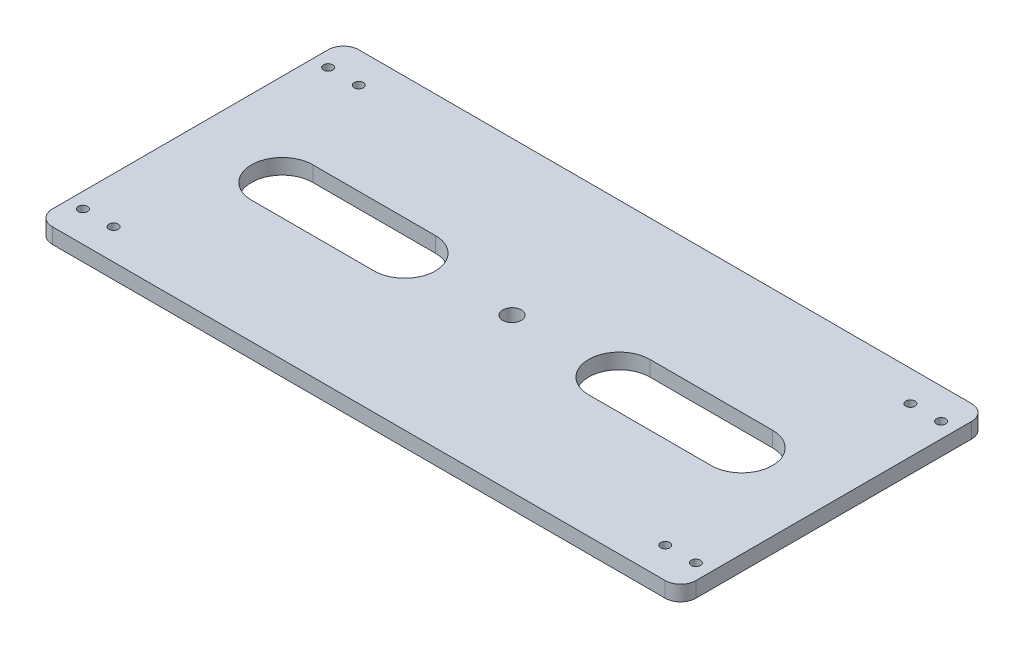
ISO-10303-21;
HEADER;
FILE_DESCRIPTION(('STEP AP214'),'2;1');
FILE_NAME('part.step','',(''),(''),'','','');
FILE_SCHEMA(('AUTOMOTIVE_DESIGN { 1 0 10303 214 1 1 1 1 }'));
ENDSEC;
DATA;
#1=APPLICATION_CONTEXT('core data for automotive mechanical design processes');
#2=APPLICATION_PROTOCOL_DEFINITION('international standard','automotive_design',2000,#1);
#3=PRODUCT_CONTEXT('',#1,'mechanical');
#4=PRODUCT('Part','Part','',(#3));
#5=PRODUCT_RELATED_PRODUCT_CATEGORY('part','',(#4));
#6=PRODUCT_DEFINITION_FORMATION('','',#4);
#7=PRODUCT_DEFINITION_CONTEXT('part definition',#1,'design');
#8=PRODUCT_DEFINITION('design','',#6,#7);
#9=PRODUCT_DEFINITION_SHAPE('','',#8);
#10=(LENGTH_UNIT() NAMED_UNIT(*) SI_UNIT(.MILLI.,.METRE.));
#11=(NAMED_UNIT(*) PLANE_ANGLE_UNIT() SI_UNIT($,.RADIAN.));
#12=(NAMED_UNIT(*) SI_UNIT($,.STERADIAN.) SOLID_ANGLE_UNIT());
#13=UNCERTAINTY_MEASURE_WITH_UNIT(LENGTH_MEASURE(1.E-05),#10,'distance_accuracy_value','');
#14=(GEOMETRIC_REPRESENTATION_CONTEXT(3) GLOBAL_UNCERTAINTY_ASSIGNED_CONTEXT((#13)) GLOBAL_UNIT_ASSIGNED_CONTEXT((#10,
#11,#12)) REPRESENTATION_CONTEXT('',''));
#15=CARTESIAN_POINT('',(0.,0.,0.));
#16=DIRECTION('',(0.,0.,1.));
#17=DIRECTION('',(1.,0.,0.));
#18=AXIS2_PLACEMENT_3D('',#15,#16,#17);
#19=CARTESIAN_POINT('',(0.,5.,0.));
#20=DIRECTION('',(1.,0.,0.));
#21=DIRECTION('',(0.,0.,-1.));
#22=AXIS2_PLACEMENT_3D('',#19,#20,#21);
#23=PLANE('',#22);
#24=DIRECTION('',(0.,0.,1.));
#25=VECTOR('',#24,1.);
#26=CARTESIAN_POINT('',(0.,5.,0.));
#27=LINE('',#26,#25);
#28=CARTESIAN_POINT('',(0.,5.,5.));
#29=VERTEX_POINT('',#28);
#30=CARTESIAN_POINT('',(0.,5.,95.));
#31=VERTEX_POINT('',#30);
#32=EDGE_CURVE('E212',#29,#31,#27,.T.);
#33=ORIENTED_EDGE('',*,*,#32,.F.);
#34=DIRECTION('',(0.,-1.,0.));
#35=VECTOR('',#34,1.);
#36=CARTESIAN_POINT('',(0.,5.,5.));
#37=LINE('',#36,#35);
#38=CARTESIAN_POINT('',(0.,0.,5.));
#39=VERTEX_POINT('',#38);
#40=EDGE_CURVE('E283',#29,#39,#37,.T.);
#41=ORIENTED_EDGE('',*,*,#40,.T.);
#42=DIRECTION('',(0.,0.,1.));
#43=VECTOR('',#42,1.);
#44=CARTESIAN_POINT('',(0.,0.,0.));
#45=LINE('',#44,#43);
#46=CARTESIAN_POINT('',(0.,0.,95.));
#47=VERTEX_POINT('',#46);
#48=EDGE_CURVE('E188',#39,#47,#45,.T.);
#49=ORIENTED_EDGE('',*,*,#48,.T.);
#50=DIRECTION('',(0.,-1.,0.));
#51=VECTOR('',#50,1.);
#52=CARTESIAN_POINT('',(0.,5.,95.));
#53=LINE('',#52,#51);
#54=EDGE_CURVE('E253',#47,#31,#53,.F.);
#55=ORIENTED_EDGE('',*,*,#54,.T.);
#56=EDGE_LOOP('',(#33,#41,#49,#55));
#57=FACE_BOUND('',#56,.T.);
#58=ADVANCED_FACE('F41',(#57),#23,.F.);
#59=CARTESIAN_POINT('',(0.,5.,100.));
#60=DIRECTION('',(0.,0.,-1.));
#61=DIRECTION('',(-1.,0.,0.));
#62=AXIS2_PLACEMENT_3D('',#59,#60,#61);
#63=PLANE('',#62);
#64=DIRECTION('',(1.,0.,0.));
#65=VECTOR('',#64,1.);
#66=CARTESIAN_POINT('',(0.,5.,100.));
#67=LINE('',#66,#65);
#68=CARTESIAN_POINT('',(5.00000000000001,5.,100.));
#69=VERTEX_POINT('',#68);
#70=CARTESIAN_POINT('',(205.,5.,100.));
#71=VERTEX_POINT('',#70);
#72=EDGE_CURVE('E215',#69,#71,#67,.T.);
#73=ORIENTED_EDGE('',*,*,#72,.F.);
#74=DIRECTION('',(0.,-1.,0.));
#75=VECTOR('',#74,1.);
#76=CARTESIAN_POINT('',(5.00000000000001,5.,100.));
#77=LINE('',#76,#75);
#78=CARTESIAN_POINT('',(5.00000000000001,0.,100.));
#79=VERTEX_POINT('',#78);
#80=EDGE_CURVE('E308',#69,#79,#77,.T.);
#81=ORIENTED_EDGE('',*,*,#80,.T.);
#82=DIRECTION('',(1.,0.,0.));
#83=VECTOR('',#82,1.);
#84=CARTESIAN_POINT('',(0.,0.,100.));
#85=LINE('',#84,#83);
#86=CARTESIAN_POINT('',(205.,0.,100.));
#87=VERTEX_POINT('',#86);
#88=EDGE_CURVE('E226',#79,#87,#85,.T.);
#89=ORIENTED_EDGE('',*,*,#88,.T.);
#90=DIRECTION('',(0.,-1.,0.));
#91=VECTOR('',#90,1.);
#92=CARTESIAN_POINT('',(205.,5.,100.));
#93=LINE('',#92,#91);
#94=EDGE_CURVE('E306',#87,#71,#93,.F.);
#95=ORIENTED_EDGE('',*,*,#94,.T.);
#96=EDGE_LOOP('',(#73,#81,#89,#95));
#97=FACE_BOUND('',#96,.T.);
#98=ADVANCED_FACE('F314',(#97),#63,.F.);
#99=CARTESIAN_POINT('',(210.,5.,0.));
#100=DIRECTION('',(-1.,0.,0.));
#101=DIRECTION('',(0.,0.,1.));
#102=AXIS2_PLACEMENT_3D('',#99,#100,#101);
#103=PLANE('',#102);
#104=DIRECTION('',(0.,0.,-1.));
#105=VECTOR('',#104,1.);
#106=CARTESIAN_POINT('',(210.,5.,0.));
#107=LINE('',#106,#105);
#108=CARTESIAN_POINT('',(210.,5.,95.));
#109=VERTEX_POINT('',#108);
#110=CARTESIAN_POINT('',(210.,5.,5.));
#111=VERTEX_POINT('',#110);
#112=EDGE_CURVE('E218',#109,#111,#107,.T.);
#113=ORIENTED_EDGE('',*,*,#112,.F.);
#114=DIRECTION('',(0.,-1.,0.));
#115=VECTOR('',#114,1.);
#116=CARTESIAN_POINT('',(210.,5.,95.));
#117=LINE('',#116,#115);
#118=CARTESIAN_POINT('',(210.,0.,95.));
#119=VERTEX_POINT('',#118);
#120=EDGE_CURVE('E11',#109,#119,#117,.T.);
#121=ORIENTED_EDGE('',*,*,#120,.T.);
#122=DIRECTION('',(0.,0.,-1.));
#123=VECTOR('',#122,1.);
#124=CARTESIAN_POINT('',(210.,0.,0.));
#125=LINE('',#124,#123);
#126=CARTESIAN_POINT('',(210.,0.,5.));
#127=VERTEX_POINT('',#126);
#128=EDGE_CURVE('E229',#119,#127,#125,.T.);
#129=ORIENTED_EDGE('',*,*,#128,.T.);
#130=DIRECTION('',(0.,-1.,0.));
#131=VECTOR('',#130,1.);
#132=CARTESIAN_POINT('',(210.,5.,5.));
#133=LINE('',#132,#131);
#134=EDGE_CURVE('E49',#127,#111,#133,.F.);
#135=ORIENTED_EDGE('',*,*,#134,.T.);
#136=EDGE_LOOP('',(#113,#121,#129,#135));
#137=FACE_BOUND('',#136,.T.);
#138=ADVANCED_FACE('F325',(#137),#103,.F.);
#139=CARTESIAN_POINT('',(0.,5.,0.));
#140=DIRECTION('',(0.,0.,1.));
#141=DIRECTION('',(1.,0.,0.));
#142=AXIS2_PLACEMENT_3D('',#139,#140,#141);
#143=PLANE('',#142);
#144=DIRECTION('',(-1.,0.,0.));
#145=VECTOR('',#144,1.);
#146=CARTESIAN_POINT('',(0.,0.,0.));
#147=LINE('',#146,#145);
#148=CARTESIAN_POINT('',(205.,0.,0.));
#149=VERTEX_POINT('',#148);
#150=CARTESIAN_POINT('',(5.,0.,0.));
#151=VERTEX_POINT('',#150);
#152=EDGE_CURVE('E216',#149,#151,#147,.T.);
#153=ORIENTED_EDGE('',*,*,#152,.T.);
#154=DIRECTION('',(0.,-1.,0.));
#155=VECTOR('',#154,1.);
#156=CARTESIAN_POINT('',(5.,5.,0.));
#157=LINE('',#156,#155);
#158=CARTESIAN_POINT('',(5.,5.,0.));
#159=VERTEX_POINT('',#158);
#160=EDGE_CURVE('E297',#151,#159,#157,.F.);
#161=ORIENTED_EDGE('',*,*,#160,.T.);
#162=DIRECTION('',(-1.,0.,0.));
#163=VECTOR('',#162,1.);
#164=CARTESIAN_POINT('',(0.,5.,0.));
#165=LINE('',#164,#163);
#166=CARTESIAN_POINT('',(205.,5.,0.));
#167=VERTEX_POINT('',#166);
#168=EDGE_CURVE('E220',#167,#159,#165,.T.);
#169=ORIENTED_EDGE('',*,*,#168,.F.);
#170=DIRECTION('',(0.,-1.,0.));
#171=VECTOR('',#170,1.);
#172=CARTESIAN_POINT('',(205.,5.,0.));
#173=LINE('',#172,#171);
#174=EDGE_CURVE('E294',#167,#149,#173,.T.);
#175=ORIENTED_EDGE('',*,*,#174,.T.);
#176=EDGE_LOOP('',(#153,#161,#169,#175));
#177=FACE_BOUND('',#176,.T.);
#178=ADVANCED_FACE('F332',(#177),#143,.F.);
#179=CARTESIAN_POINT('',(0.,5.,0.));
#180=DIRECTION('',(0.,1.,0.));
#181=DIRECTION('',(0.,0.,1.));
#182=AXIS2_PLACEMENT_3D('',#179,#180,#181);
#183=PLANE('',#182);
#184=CARTESIAN_POINT('',(205.,5.,9.99999999999997));
#185=DIRECTION('',(0.,1.,0.));
#186=DIRECTION('',(0.,0.,-1.));
#187=AXIS2_PLACEMENT_3D('',#184,#185,#186);
#188=CIRCLE('',#187,1.5);
#189=CARTESIAN_POINT('',(205.,5.,8.49999999999998));
#190=VERTEX_POINT('',#189);
#191=EDGE_CURVE('E461',#190,#190,#188,.T.);
#192=ORIENTED_EDGE('',*,*,#191,.F.);
#193=EDGE_LOOP('',(#192));
#194=FACE_BOUND('',#193,.T.);
#195=CARTESIAN_POINT('',(205.,5.,90.));
#196=DIRECTION('',(0.,1.,0.));
#197=DIRECTION('',(0.,0.,1.));
#198=AXIS2_PLACEMENT_3D('',#195,#196,#197);
#199=CIRCLE('',#198,1.5);
#200=CARTESIAN_POINT('',(205.,5.,91.5));
#201=VERTEX_POINT('',#200);
#202=EDGE_CURVE('E468',#201,#201,#199,.T.);
#203=ORIENTED_EDGE('',*,*,#202,.F.);
#204=EDGE_LOOP('',(#203));
#205=FACE_BOUND('',#204,.T.);
#206=CARTESIAN_POINT('',(5.,5.,90.));
#207=DIRECTION('',(0.,1.,0.));
#208=DIRECTION('',(0.,0.,-1.));
#209=AXIS2_PLACEMENT_3D('',#206,#207,#208);
#210=CIRCLE('',#209,1.5);
#211=CARTESIAN_POINT('',(5.,5.,88.5));
#212=VERTEX_POINT('',#211);
#213=EDGE_CURVE('E465',#212,#212,#210,.T.);
#214=ORIENTED_EDGE('',*,*,#213,.F.);
#215=EDGE_LOOP('',(#214));
#216=FACE_BOUND('',#215,.T.);
#217=CARTESIAN_POINT('',(15.,5.,10.));
#218=DIRECTION('',(0.,1.,0.));
#219=DIRECTION('',(0.,0.,1.));
#220=AXIS2_PLACEMENT_3D('',#217,#218,#219);
#221=CIRCLE('',#220,1.5);
#222=CARTESIAN_POINT('',(15.,5.,11.5));
#223=VERTEX_POINT('',#222);
#224=EDGE_CURVE('E462',#223,#223,#221,.T.);
#225=ORIENTED_EDGE('',*,*,#224,.F.);
#226=EDGE_LOOP('',(#225));
#227=FACE_BOUND('',#226,.T.);
#228=CARTESIAN_POINT('',(15.,5.,90.));
#229=DIRECTION('',(0.,1.,0.));
#230=DIRECTION('',(0.,0.,-1.));
#231=AXIS2_PLACEMENT_3D('',#228,#229,#230);
#232=CIRCLE('',#231,1.5);
#233=CARTESIAN_POINT('',(15.,5.,88.5));
#234=VERTEX_POINT('',#233);
#235=EDGE_CURVE('E434',#234,#234,#232,.T.);
#236=ORIENTED_EDGE('',*,*,#235,.F.);
#237=EDGE_LOOP('',(#236));
#238=FACE_BOUND('',#237,.T.);
#239=CARTESIAN_POINT('',(195.,5.,90.));
#240=DIRECTION('',(0.,1.,0.));
#241=DIRECTION('',(0.,0.,1.));
#242=AXIS2_PLACEMENT_3D('',#239,#240,#241);
#243=CIRCLE('',#242,1.49999999999997);
#244=CARTESIAN_POINT('',(195.,5.,91.4999999999999));
#245=VERTEX_POINT('',#244);
#246=EDGE_CURVE('E476',#245,#245,#243,.T.);
#247=ORIENTED_EDGE('',*,*,#246,.F.);
#248=EDGE_LOOP('',(#247));
#249=FACE_BOUND('',#248,.T.);
#250=CARTESIAN_POINT('',(195.,5.,9.99999999999998));
#251=DIRECTION('',(0.,1.,0.));
#252=DIRECTION('',(0.,0.,-1.));
#253=AXIS2_PLACEMENT_3D('',#250,#251,#252);
#254=CIRCLE('',#253,1.5);
#255=CARTESIAN_POINT('',(195.,5.,8.49999999999998));
#256=VERTEX_POINT('',#255);
#257=EDGE_CURVE('E473',#256,#256,#254,.T.);
#258=ORIENTED_EDGE('',*,*,#257,.F.);
#259=EDGE_LOOP('',(#258));
#260=FACE_BOUND('',#259,.T.);
#261=CARTESIAN_POINT('',(5.,5.,10.));
#262=DIRECTION('',(0.,1.,0.));
#263=DIRECTION('',(0.,0.,1.));
#264=AXIS2_PLACEMENT_3D('',#261,#262,#263);
#265=CIRCLE('',#264,1.5);
#266=CARTESIAN_POINT('',(5.,5.,11.5));
#267=VERTEX_POINT('',#266);
#268=EDGE_CURVE('E261',#267,#267,#265,.T.);
#269=ORIENTED_EDGE('',*,*,#268,.F.);
#270=EDGE_LOOP('',(#269));
#271=FACE_BOUND('',#270,.T.);
#272=CARTESIAN_POINT('',(105.,5.,50.));
#273=DIRECTION('',(0.,1.,0.));
#274=DIRECTION('',(0.,0.,1.));
#275=AXIS2_PLACEMENT_3D('',#272,#273,#274);
#276=CIRCLE('',#275,3.00000000000001);
#277=CARTESIAN_POINT('',(105.,5.,53.));
#278=VERTEX_POINT('',#277);
#279=EDGE_CURVE('E256',#278,#278,#276,.T.);
#280=ORIENTED_EDGE('',*,*,#279,.F.);
#281=EDGE_LOOP('',(#280));
#282=FACE_BOUND('',#281,.T.);
#283=CARTESIAN_POINT('',(30.,5.,50.));
#284=DIRECTION('',(0.,1.,0.));
#285=DIRECTION('',(0.,0.,1.));
#286=AXIS2_PLACEMENT_3D('',#283,#284,#285);
#287=CIRCLE('',#286,10.);
#288=CARTESIAN_POINT('',(30.,5.,40.));
#289=VERTEX_POINT('',#288);
#290=CARTESIAN_POINT('',(30.,5.,60.));
#291=VERTEX_POINT('',#290);
#292=EDGE_CURVE('E176',#289,#291,#287,.T.);
#293=ORIENTED_EDGE('',*,*,#292,.F.);
#294=DIRECTION('',(-1.,0.,0.));
#295=VECTOR('',#294,1.);
#296=CARTESIAN_POINT('',(30.,5.,40.));
#297=LINE('',#296,#295);
#298=CARTESIAN_POINT('',(70.,5.,40.));
#299=VERTEX_POINT('',#298);
#300=EDGE_CURVE('E181',#299,#289,#297,.T.);
#301=ORIENTED_EDGE('',*,*,#300,.F.);
#302=CARTESIAN_POINT('',(70.,5.,50.));
#303=DIRECTION('',(0.,1.,0.));
#304=DIRECTION('',(0.,0.,1.));
#305=AXIS2_PLACEMENT_3D('',#302,#303,#304);
#306=CIRCLE('',#305,10.);
#307=CARTESIAN_POINT('',(70.,5.,60.));
#308=VERTEX_POINT('',#307);
#309=EDGE_CURVE('E160',#308,#299,#306,.T.);
#310=ORIENTED_EDGE('',*,*,#309,.F.);
#311=DIRECTION('',(1.,0.,0.));
#312=VECTOR('',#311,1.);
#313=CARTESIAN_POINT('',(30.,5.,60.));
#314=LINE('',#313,#312);
#315=EDGE_CURVE('E171',#291,#308,#314,.T.);
#316=ORIENTED_EDGE('',*,*,#315,.F.);
#317=EDGE_LOOP('',(#293,#301,#310,#316));
#318=FACE_BOUND('',#317,.T.);
#319=CARTESIAN_POINT('',(140.,5.,50.));
#320=DIRECTION('',(0.,1.,0.));
#321=DIRECTION('',(0.,0.,1.));
#322=AXIS2_PLACEMENT_3D('',#319,#320,#321);
#323=CIRCLE('',#322,10.);
#324=CARTESIAN_POINT('',(140.,5.,40.));
#325=VERTEX_POINT('',#324);
#326=CARTESIAN_POINT('',(140.,5.,60.));
#327=VERTEX_POINT('',#326);
#328=EDGE_CURVE('E210',#325,#327,#323,.T.);
#329=ORIENTED_EDGE('',*,*,#328,.F.);
#330=DIRECTION('',(-1.,0.,0.));
#331=VECTOR('',#330,1.);
#332=CARTESIAN_POINT('',(140.,5.,40.));
#333=LINE('',#332,#331);
#334=CARTESIAN_POINT('',(180.,5.,40.));
#335=VERTEX_POINT('',#334);
#336=EDGE_CURVE('E194',#335,#325,#333,.T.);
#337=ORIENTED_EDGE('',*,*,#336,.F.);
#338=CARTESIAN_POINT('',(180.,5.,50.));
#339=DIRECTION('',(0.,1.,0.));
#340=DIRECTION('',(0.,0.,1.));
#341=AXIS2_PLACEMENT_3D('',#338,#339,#340);
#342=CIRCLE('',#341,9.99999999999999);
#343=CARTESIAN_POINT('',(180.,5.,60.));
#344=VERTEX_POINT('',#343);
#345=EDGE_CURVE('E204',#344,#335,#342,.T.);
#346=ORIENTED_EDGE('',*,*,#345,.F.);
#347=DIRECTION('',(1.,0.,0.));
#348=VECTOR('',#347,1.);
#349=CARTESIAN_POINT('',(140.,5.,60.));
#350=LINE('',#349,#348);
#351=EDGE_CURVE('E207',#327,#344,#350,.T.);
#352=ORIENTED_EDGE('',*,*,#351,.F.);
#353=EDGE_LOOP('',(#329,#337,#346,#352));
#354=FACE_BOUND('',#353,.T.);
#355=ORIENTED_EDGE('',*,*,#168,.T.);
#356=CARTESIAN_POINT('',(5.,5.,5.));
#357=DIRECTION('',(0.,1.,0.));
#358=DIRECTION('',(0.,0.,1.));
#359=AXIS2_PLACEMENT_3D('',#356,#357,#358);
#360=CIRCLE('',#359,5.);
#361=EDGE_CURVE('E304',#159,#29,#360,.T.);
#362=ORIENTED_EDGE('',*,*,#361,.T.);
#363=ORIENTED_EDGE('',*,*,#32,.T.);
#364=CARTESIAN_POINT('',(5.00000000000001,5.,95.));
#365=DIRECTION('',(0.,1.,0.));
#366=DIRECTION('',(0.,0.,1.));
#367=AXIS2_PLACEMENT_3D('',#364,#365,#366);
#368=CIRCLE('',#367,5.);
#369=EDGE_CURVE('E302',#31,#69,#368,.T.);
#370=ORIENTED_EDGE('',*,*,#369,.T.);
#371=ORIENTED_EDGE('',*,*,#72,.T.);
#372=CARTESIAN_POINT('',(205.,5.,95.));
#373=DIRECTION('',(0.,1.,0.));
#374=DIRECTION('',(0.,0.,1.));
#375=AXIS2_PLACEMENT_3D('',#372,#373,#374);
#376=CIRCLE('',#375,5.);
#377=EDGE_CURVE('E62',#71,#109,#376,.T.);
#378=ORIENTED_EDGE('',*,*,#377,.T.);
#379=ORIENTED_EDGE('',*,*,#112,.T.);
#380=CARTESIAN_POINT('',(205.,5.,5.));
#381=DIRECTION('',(0.,1.,0.));
#382=DIRECTION('',(0.,0.,1.));
#383=AXIS2_PLACEMENT_3D('',#380,#381,#382);
#384=CIRCLE('',#383,5.);
#385=EDGE_CURVE('E299',#111,#167,#384,.T.);
#386=ORIENTED_EDGE('',*,*,#385,.T.);
#387=EDGE_LOOP('',(#355,#362,#363,#370,#371,#378,#379,#386));
#388=FACE_BOUND('',#387,.T.);
#389=ADVANCED_FACE('F178',(#194,#205,#216,#227,#238,#249,#260,#271,#282,#318,#354,#388),#183,.T.);
#390=CARTESIAN_POINT('',(0.,0.,0.));
#391=DIRECTION('',(0.,1.,0.));
#392=DIRECTION('',(0.,0.,1.));
#393=AXIS2_PLACEMENT_3D('',#390,#391,#392);
#394=PLANE('',#393);
#395=CARTESIAN_POINT('',(205.,0.,9.99999999999997));
#396=DIRECTION('',(0.,1.,0.));
#397=DIRECTION('',(0.,0.,1.));
#398=AXIS2_PLACEMENT_3D('',#395,#396,#397);
#399=CIRCLE('',#398,1.5);
#400=CARTESIAN_POINT('',(205.,0.,11.5));
#401=VERTEX_POINT('',#400);
#402=EDGE_CURVE('E279',#401,#401,#399,.T.);
#403=ORIENTED_EDGE('',*,*,#402,.T.);
#404=EDGE_LOOP('',(#403));
#405=FACE_BOUND('',#404,.T.);
#406=CARTESIAN_POINT('',(205.,0.,90.));
#407=DIRECTION('',(0.,1.,0.));
#408=DIRECTION('',(0.,0.,1.));
#409=AXIS2_PLACEMENT_3D('',#406,#407,#408);
#410=CIRCLE('',#409,1.5);
#411=CARTESIAN_POINT('',(205.,0.,91.5));
#412=VERTEX_POINT('',#411);
#413=EDGE_CURVE('E276',#412,#412,#410,.T.);
#414=ORIENTED_EDGE('',*,*,#413,.T.);
#415=EDGE_LOOP('',(#414));
#416=FACE_BOUND('',#415,.T.);
#417=CARTESIAN_POINT('',(5.,0.,90.));
#418=DIRECTION('',(0.,1.,0.));
#419=DIRECTION('',(0.,0.,1.));
#420=AXIS2_PLACEMENT_3D('',#417,#418,#419);
#421=CIRCLE('',#420,1.5);
#422=CARTESIAN_POINT('',(5.,0.,91.5));
#423=VERTEX_POINT('',#422);
#424=EDGE_CURVE('E273',#423,#423,#421,.T.);
#425=ORIENTED_EDGE('',*,*,#424,.T.);
#426=EDGE_LOOP('',(#425));
#427=FACE_BOUND('',#426,.T.);
#428=CARTESIAN_POINT('',(15.,0.,10.));
#429=DIRECTION('',(0.,1.,0.));
#430=DIRECTION('',(0.,0.,1.));
#431=AXIS2_PLACEMENT_3D('',#428,#429,#430);
#432=CIRCLE('',#431,1.5);
#433=CARTESIAN_POINT('',(15.,0.,11.5));
#434=VERTEX_POINT('',#433);
#435=EDGE_CURVE('E270',#434,#434,#432,.T.);
#436=ORIENTED_EDGE('',*,*,#435,.T.);
#437=EDGE_LOOP('',(#436));
#438=FACE_BOUND('',#437,.T.);
#439=CARTESIAN_POINT('',(15.,0.,90.));
#440=DIRECTION('',(0.,1.,0.));
#441=DIRECTION('',(0.,0.,1.));
#442=AXIS2_PLACEMENT_3D('',#439,#440,#441);
#443=CIRCLE('',#442,1.5);
#444=CARTESIAN_POINT('',(15.,0.,91.5));
#445=VERTEX_POINT('',#444);
#446=EDGE_CURVE('E267',#445,#445,#443,.T.);
#447=ORIENTED_EDGE('',*,*,#446,.T.);
#448=EDGE_LOOP('',(#447));
#449=FACE_BOUND('',#448,.T.);
#450=CARTESIAN_POINT('',(195.,0.,90.));
#451=DIRECTION('',(0.,1.,0.));
#452=DIRECTION('',(0.,0.,1.));
#453=AXIS2_PLACEMENT_3D('',#450,#451,#452);
#454=CIRCLE('',#453,1.49999999999997);
#455=CARTESIAN_POINT('',(195.,0.,91.4999999999999));
#456=VERTEX_POINT('',#455);
#457=EDGE_CURVE('E264',#456,#456,#454,.T.);
#458=ORIENTED_EDGE('',*,*,#457,.T.);
#459=EDGE_LOOP('',(#458));
#460=FACE_BOUND('',#459,.T.);
#461=CARTESIAN_POINT('',(195.,0.,9.99999999999998));
#462=DIRECTION('',(0.,1.,0.));
#463=DIRECTION('',(0.,0.,1.));
#464=AXIS2_PLACEMENT_3D('',#461,#462,#463);
#465=CIRCLE('',#464,1.5);
#466=CARTESIAN_POINT('',(195.,0.,11.5));
#467=VERTEX_POINT('',#466);
#468=EDGE_CURVE('E260',#467,#467,#465,.T.);
#469=ORIENTED_EDGE('',*,*,#468,.T.);
#470=EDGE_LOOP('',(#469));
#471=FACE_BOUND('',#470,.T.);
#472=CARTESIAN_POINT('',(5.,0.,10.));
#473=DIRECTION('',(0.,1.,0.));
#474=DIRECTION('',(0.,0.,1.));
#475=AXIS2_PLACEMENT_3D('',#472,#473,#474);
#476=CIRCLE('',#475,1.5);
#477=CARTESIAN_POINT('',(5.,0.,11.5));
#478=VERTEX_POINT('',#477);
#479=EDGE_CURVE('E257',#478,#478,#476,.T.);
#480=ORIENTED_EDGE('',*,*,#479,.T.);
#481=EDGE_LOOP('',(#480));
#482=FACE_BOUND('',#481,.T.);
#483=CARTESIAN_POINT('',(105.,0.,50.));
#484=DIRECTION('',(0.,1.,0.));
#485=DIRECTION('',(0.,0.,1.));
#486=AXIS2_PLACEMENT_3D('',#483,#484,#485);
#487=CIRCLE('',#486,3.00000000000001);
#488=CARTESIAN_POINT('',(105.,0.,53.));
#489=VERTEX_POINT('',#488);
#490=EDGE_CURVE('E201',#489,#489,#487,.T.);
#491=ORIENTED_EDGE('',*,*,#490,.T.);
#492=EDGE_LOOP('',(#491));
#493=FACE_BOUND('',#492,.T.);
#494=DIRECTION('',(-1.,0.,0.));
#495=VECTOR('',#494,1.);
#496=CARTESIAN_POINT('',(0.,0.,40.));
#497=LINE('',#496,#495);
#498=CARTESIAN_POINT('',(70.,0.,40.));
#499=VERTEX_POINT('',#498);
#500=CARTESIAN_POINT('',(30.,0.,40.));
#501=VERTEX_POINT('',#500);
#502=EDGE_CURVE('E247',#499,#501,#497,.T.);
#503=ORIENTED_EDGE('',*,*,#502,.T.);
#504=CARTESIAN_POINT('',(30.,0.,50.));
#505=DIRECTION('',(0.,1.,0.));
#506=DIRECTION('',(0.,0.,1.));
#507=AXIS2_PLACEMENT_3D('',#504,#505,#506);
#508=CIRCLE('',#507,10.);
#509=CARTESIAN_POINT('',(30.,0.,60.));
#510=VERTEX_POINT('',#509);
#511=EDGE_CURVE('E250',#501,#510,#508,.T.);
#512=ORIENTED_EDGE('',*,*,#511,.T.);
#513=DIRECTION('',(1.,0.,0.));
#514=VECTOR('',#513,1.);
#515=CARTESIAN_POINT('',(0.,0.,60.));
#516=LINE('',#515,#514);
#517=CARTESIAN_POINT('',(70.,0.,60.));
#518=VERTEX_POINT('',#517);
#519=EDGE_CURVE('E244',#510,#518,#516,.T.);
#520=ORIENTED_EDGE('',*,*,#519,.T.);
#521=CARTESIAN_POINT('',(70.,0.,50.));
#522=DIRECTION('',(0.,1.,0.));
#523=DIRECTION('',(0.,0.,1.));
#524=AXIS2_PLACEMENT_3D('',#521,#522,#523);
#525=CIRCLE('',#524,10.);
#526=EDGE_CURVE('E163',#518,#499,#525,.T.);
#527=ORIENTED_EDGE('',*,*,#526,.T.);
#528=EDGE_LOOP('',(#503,#512,#520,#527));
#529=FACE_BOUND('',#528,.T.);
#530=DIRECTION('',(-1.,0.,0.));
#531=VECTOR('',#530,1.);
#532=CARTESIAN_POINT('',(0.,0.,40.));
#533=LINE('',#532,#531);
#534=CARTESIAN_POINT('',(180.,0.,40.));
#535=VERTEX_POINT('',#534);
#536=CARTESIAN_POINT('',(140.,0.,40.));
#537=VERTEX_POINT('',#536);
#538=EDGE_CURVE('E238',#535,#537,#533,.T.);
#539=ORIENTED_EDGE('',*,*,#538,.T.);
#540=CARTESIAN_POINT('',(140.,0.,50.));
#541=DIRECTION('',(0.,1.,0.));
#542=DIRECTION('',(0.,0.,1.));
#543=AXIS2_PLACEMENT_3D('',#540,#541,#542);
#544=CIRCLE('',#543,10.);
#545=CARTESIAN_POINT('',(140.,0.,60.));
#546=VERTEX_POINT('',#545);
#547=EDGE_CURVE('E241',#537,#546,#544,.T.);
#548=ORIENTED_EDGE('',*,*,#547,.T.);
#549=DIRECTION('',(1.,0.,0.));
#550=VECTOR('',#549,1.);
#551=CARTESIAN_POINT('',(0.,0.,60.));
#552=LINE('',#551,#550);
#553=CARTESIAN_POINT('',(180.,0.,60.));
#554=VERTEX_POINT('',#553);
#555=EDGE_CURVE('E223',#546,#554,#552,.T.);
#556=ORIENTED_EDGE('',*,*,#555,.T.);
#557=CARTESIAN_POINT('',(180.,0.,50.));
#558=DIRECTION('',(0.,1.,0.));
#559=DIRECTION('',(0.,0.,1.));
#560=AXIS2_PLACEMENT_3D('',#557,#558,#559);
#561=CIRCLE('',#560,9.99999999999999);
#562=EDGE_CURVE('E235',#554,#535,#561,.T.);
#563=ORIENTED_EDGE('',*,*,#562,.T.);
#564=EDGE_LOOP('',(#539,#548,#556,#563));
#565=FACE_BOUND('',#564,.T.);
#566=ORIENTED_EDGE('',*,*,#48,.F.);
#567=CARTESIAN_POINT('',(5.,0.,5.));
#568=DIRECTION('',(0.,1.,0.));
#569=DIRECTION('',(0.,0.,1.));
#570=AXIS2_PLACEMENT_3D('',#567,#568,#569);
#571=CIRCLE('',#570,5.);
#572=EDGE_CURVE('E292',#39,#151,#571,.F.);
#573=ORIENTED_EDGE('',*,*,#572,.T.);
#574=ORIENTED_EDGE('',*,*,#152,.F.);
#575=CARTESIAN_POINT('',(205.,0.,5.));
#576=DIRECTION('',(0.,1.,0.));
#577=DIRECTION('',(0.,0.,1.));
#578=AXIS2_PLACEMENT_3D('',#575,#576,#577);
#579=CIRCLE('',#578,5.);
#580=EDGE_CURVE('E286',#149,#127,#579,.F.);
#581=ORIENTED_EDGE('',*,*,#580,.T.);
#582=ORIENTED_EDGE('',*,*,#128,.F.);
#583=CARTESIAN_POINT('',(205.,0.,95.));
#584=DIRECTION('',(0.,1.,0.));
#585=DIRECTION('',(0.,0.,1.));
#586=AXIS2_PLACEMENT_3D('',#583,#584,#585);
#587=CIRCLE('',#586,5.);
#588=EDGE_CURVE('E288',#119,#87,#587,.F.);
#589=ORIENTED_EDGE('',*,*,#588,.T.);
#590=ORIENTED_EDGE('',*,*,#88,.F.);
#591=CARTESIAN_POINT('',(5.00000000000001,0.,95.));
#592=DIRECTION('',(0.,1.,0.));
#593=DIRECTION('',(0.,0.,1.));
#594=AXIS2_PLACEMENT_3D('',#591,#592,#593);
#595=CIRCLE('',#594,5.);
#596=EDGE_CURVE('E290',#79,#47,#595,.F.);
#597=ORIENTED_EDGE('',*,*,#596,.T.);
#598=EDGE_LOOP('',(#566,#573,#574,#581,#582,#589,#590,#597));
#599=FACE_BOUND('',#598,.T.);
#600=ADVANCED_FACE('F320',(#405,#416,#427,#438,#449,#460,#471,#482,#493,#529,#565,#599),#394,.F.);
#601=CARTESIAN_POINT('',(140.,-35.,50.));
#602=DIRECTION('',(0.,1.,0.));
#603=DIRECTION('',(0.,0.,1.));
#604=AXIS2_PLACEMENT_3D('',#601,#602,#603);
#605=CYLINDRICAL_SURFACE('',#604,10.);
#606=DIRECTION('',(0.,1.,0.));
#607=VECTOR('',#606,1.);
#608=CARTESIAN_POINT('',(140.,-35.,40.));
#609=LINE('',#608,#607);
#610=EDGE_CURVE('E199',#537,#325,#609,.T.);
#611=ORIENTED_EDGE('',*,*,#610,.T.);
#612=ORIENTED_EDGE('',*,*,#328,.T.);
#613=DIRECTION('',(0.,1.,0.));
#614=VECTOR('',#613,1.);
#615=CARTESIAN_POINT('',(140.,-35.,60.));
#616=LINE('',#615,#614);
#617=EDGE_CURVE('E191',#546,#327,#616,.T.);
#618=ORIENTED_EDGE('',*,*,#617,.F.);
#619=ORIENTED_EDGE('',*,*,#547,.F.);
#620=EDGE_LOOP('',(#611,#612,#618,#619));
#621=FACE_BOUND('',#620,.T.);
#622=ADVANCED_FACE('F364',(#621),#605,.F.);
#623=CARTESIAN_POINT('',(140.,-35.,40.));
#624=DIRECTION('',(0.,0.,-1.));
#625=DIRECTION('',(-1.,0.,0.));
#626=AXIS2_PLACEMENT_3D('',#623,#624,#625);
#627=PLANE('',#626);
#628=DIRECTION('',(0.,1.,0.));
#629=VECTOR('',#628,1.);
#630=CARTESIAN_POINT('',(180.,-35.,40.));
#631=LINE('',#630,#629);
#632=EDGE_CURVE('E197',#535,#335,#631,.T.);
#633=ORIENTED_EDGE('',*,*,#632,.T.);
#634=ORIENTED_EDGE('',*,*,#336,.T.);
#635=ORIENTED_EDGE('',*,*,#610,.F.);
#636=ORIENTED_EDGE('',*,*,#538,.F.);
#637=EDGE_LOOP('',(#633,#634,#635,#636));
#638=FACE_BOUND('',#637,.T.);
#639=ADVANCED_FACE('F369',(#638),#627,.F.);
#640=CARTESIAN_POINT('',(180.,-35.,50.));
#641=DIRECTION('',(0.,1.,0.));
#642=DIRECTION('',(0.,0.,1.));
#643=AXIS2_PLACEMENT_3D('',#640,#641,#642);
#644=CYLINDRICAL_SURFACE('',#643,9.99999999999999);
#645=DIRECTION('',(0.,1.,0.));
#646=VECTOR('',#645,1.);
#647=CARTESIAN_POINT('',(180.,-35.,60.));
#648=LINE('',#647,#646);
#649=EDGE_CURVE('E195',#554,#344,#648,.T.);
#650=ORIENTED_EDGE('',*,*,#649,.T.);
#651=ORIENTED_EDGE('',*,*,#345,.T.);
#652=ORIENTED_EDGE('',*,*,#632,.F.);
#653=ORIENTED_EDGE('',*,*,#562,.F.);
#654=EDGE_LOOP('',(#650,#651,#652,#653));
#655=FACE_BOUND('',#654,.T.);
#656=ADVANCED_FACE('F372',(#655),#644,.F.);
#657=CARTESIAN_POINT('',(140.,-35.,60.));
#658=DIRECTION('',(0.,0.,1.));
#659=DIRECTION('',(1.,0.,0.));
#660=AXIS2_PLACEMENT_3D('',#657,#658,#659);
#661=PLANE('',#660);
#662=ORIENTED_EDGE('',*,*,#617,.T.);
#663=ORIENTED_EDGE('',*,*,#351,.T.);
#664=ORIENTED_EDGE('',*,*,#649,.F.);
#665=ORIENTED_EDGE('',*,*,#555,.F.);
#666=EDGE_LOOP('',(#662,#663,#664,#665));
#667=FACE_BOUND('',#666,.T.);
#668=ADVANCED_FACE('F376',(#667),#661,.F.);
#669=CARTESIAN_POINT('',(30.,-35.,50.));
#670=DIRECTION('',(0.,1.,0.));
#671=DIRECTION('',(0.,0.,1.));
#672=AXIS2_PLACEMENT_3D('',#669,#670,#671);
#673=CYLINDRICAL_SURFACE('',#672,10.);
#674=DIRECTION('',(0.,1.,0.));
#675=VECTOR('',#674,1.);
#676=CARTESIAN_POINT('',(30.,-35.,40.));
#677=LINE('',#676,#675);
#678=EDGE_CURVE('E186',#501,#289,#677,.T.);
#679=ORIENTED_EDGE('',*,*,#678,.T.);
#680=ORIENTED_EDGE('',*,*,#292,.T.);
#681=DIRECTION('',(0.,1.,0.));
#682=VECTOR('',#681,1.);
#683=CARTESIAN_POINT('',(30.,-35.,60.));
#684=LINE('',#683,#682);
#685=EDGE_CURVE('E167',#510,#291,#684,.T.);
#686=ORIENTED_EDGE('',*,*,#685,.F.);
#687=ORIENTED_EDGE('',*,*,#511,.F.);
#688=EDGE_LOOP('',(#679,#680,#686,#687));
#689=FACE_BOUND('',#688,.T.);
#690=ADVANCED_FACE('F380',(#689),#673,.F.);
#691=CARTESIAN_POINT('',(30.,-35.,40.));
#692=DIRECTION('',(0.,0.,-1.));
#693=DIRECTION('',(-1.,0.,0.));
#694=AXIS2_PLACEMENT_3D('',#691,#692,#693);
#695=PLANE('',#694);
#696=DIRECTION('',(0.,1.,0.));
#697=VECTOR('',#696,1.);
#698=CARTESIAN_POINT('',(70.,-35.,40.));
#699=LINE('',#698,#697);
#700=EDGE_CURVE('E166',#499,#299,#699,.T.);
#701=ORIENTED_EDGE('',*,*,#700,.T.);
#702=ORIENTED_EDGE('',*,*,#300,.T.);
#703=ORIENTED_EDGE('',*,*,#678,.F.);
#704=ORIENTED_EDGE('',*,*,#502,.F.);
#705=EDGE_LOOP('',(#701,#702,#703,#704));
#706=FACE_BOUND('',#705,.T.);
#707=ADVANCED_FACE('F387',(#706),#695,.F.);
#708=CARTESIAN_POINT('',(70.,-35.,50.));
#709=DIRECTION('',(0.,1.,0.));
#710=DIRECTION('',(0.,0.,1.));
#711=AXIS2_PLACEMENT_3D('',#708,#709,#710);
#712=CYLINDRICAL_SURFACE('',#711,10.);
#713=DIRECTION('',(0.,1.,0.));
#714=VECTOR('',#713,1.);
#715=CARTESIAN_POINT('',(70.,-35.,60.));
#716=LINE('',#715,#714);
#717=EDGE_CURVE('E155',#518,#308,#716,.T.);
#718=ORIENTED_EDGE('',*,*,#717,.T.);
#719=ORIENTED_EDGE('',*,*,#309,.T.);
#720=ORIENTED_EDGE('',*,*,#700,.F.);
#721=ORIENTED_EDGE('',*,*,#526,.F.);
#722=EDGE_LOOP('',(#718,#719,#720,#721));
#723=FACE_BOUND('',#722,.T.);
#724=ADVANCED_FACE('F157',(#723),#712,.F.);
#725=CARTESIAN_POINT('',(30.,-35.,60.));
#726=DIRECTION('',(0.,0.,1.));
#727=DIRECTION('',(1.,0.,0.));
#728=AXIS2_PLACEMENT_3D('',#725,#726,#727);
#729=PLANE('',#728);
#730=ORIENTED_EDGE('',*,*,#685,.T.);
#731=ORIENTED_EDGE('',*,*,#315,.T.);
#732=ORIENTED_EDGE('',*,*,#717,.F.);
#733=ORIENTED_EDGE('',*,*,#519,.F.);
#734=EDGE_LOOP('',(#730,#731,#732,#733));
#735=FACE_BOUND('',#734,.T.);
#736=ADVANCED_FACE('F172',(#735),#729,.F.);
#737=CARTESIAN_POINT('',(105.,-15.,50.));
#738=DIRECTION('',(0.,1.,0.));
#739=DIRECTION('',(0.,0.,1.));
#740=AXIS2_PLACEMENT_3D('',#737,#738,#739);
#741=CYLINDRICAL_SURFACE('',#740,3.00000000000001);
#742=ORIENTED_EDGE('',*,*,#279,.T.);
#743=EDGE_LOOP('',(#742));
#744=FACE_BOUND('',#743,.T.);
#745=ORIENTED_EDGE('',*,*,#490,.F.);
#746=EDGE_LOOP('',(#745));
#747=FACE_BOUND('',#746,.T.);
#748=ADVANCED_FACE('F391',(#744,#747),#741,.F.);
#749=CARTESIAN_POINT('',(5.,-15.,10.));
#750=DIRECTION('',(0.,1.,0.));
#751=DIRECTION('',(0.,0.,1.));
#752=AXIS2_PLACEMENT_3D('',#749,#750,#751);
#753=CYLINDRICAL_SURFACE('',#752,1.5);
#754=ORIENTED_EDGE('',*,*,#268,.T.);
#755=EDGE_LOOP('',(#754));
#756=FACE_BOUND('',#755,.T.);
#757=ORIENTED_EDGE('',*,*,#479,.F.);
#758=EDGE_LOOP('',(#757));
#759=FACE_BOUND('',#758,.T.);
#760=ADVANCED_FACE('F399',(#756,#759),#753,.F.);
#761=CARTESIAN_POINT('',(195.,-15.,9.99999999999998));
#762=DIRECTION('',(0.,1.,0.));
#763=DIRECTION('',(0.,0.,1.));
#764=AXIS2_PLACEMENT_3D('',#761,#762,#763);
#765=CYLINDRICAL_SURFACE('',#764,1.5);
#766=ORIENTED_EDGE('',*,*,#257,.T.);
#767=EDGE_LOOP('',(#766));
#768=FACE_BOUND('',#767,.T.);
#769=ORIENTED_EDGE('',*,*,#468,.F.);
#770=EDGE_LOOP('',(#769));
#771=FACE_BOUND('',#770,.T.);
#772=ADVANCED_FACE('F403',(#768,#771),#765,.F.);
#773=CARTESIAN_POINT('',(195.,-15.,90.));
#774=DIRECTION('',(0.,1.,0.));
#775=DIRECTION('',(0.,0.,1.));
#776=AXIS2_PLACEMENT_3D('',#773,#774,#775);
#777=CYLINDRICAL_SURFACE('',#776,1.49999999999997);
#778=ORIENTED_EDGE('',*,*,#246,.T.);
#779=EDGE_LOOP('',(#778));
#780=FACE_BOUND('',#779,.T.);
#781=ORIENTED_EDGE('',*,*,#457,.F.);
#782=EDGE_LOOP('',(#781));
#783=FACE_BOUND('',#782,.T.);
#784=ADVANCED_FACE('F422',(#780,#783),#777,.F.);
#785=CARTESIAN_POINT('',(15.,-15.,90.));
#786=DIRECTION('',(0.,1.,0.));
#787=DIRECTION('',(0.,0.,1.));
#788=AXIS2_PLACEMENT_3D('',#785,#786,#787);
#789=CYLINDRICAL_SURFACE('',#788,1.5);
#790=ORIENTED_EDGE('',*,*,#235,.T.);
#791=EDGE_LOOP('',(#790));
#792=FACE_BOUND('',#791,.T.);
#793=ORIENTED_EDGE('',*,*,#446,.F.);
#794=EDGE_LOOP('',(#793));
#795=FACE_BOUND('',#794,.T.);
#796=ADVANCED_FACE('F409',(#792,#795),#789,.F.);
#797=CARTESIAN_POINT('',(15.,-15.,10.));
#798=DIRECTION('',(0.,1.,0.));
#799=DIRECTION('',(0.,0.,1.));
#800=AXIS2_PLACEMENT_3D('',#797,#798,#799);
#801=CYLINDRICAL_SURFACE('',#800,1.5);
#802=ORIENTED_EDGE('',*,*,#224,.T.);
#803=EDGE_LOOP('',(#802));
#804=FACE_BOUND('',#803,.T.);
#805=ORIENTED_EDGE('',*,*,#435,.F.);
#806=EDGE_LOOP('',(#805));
#807=FACE_BOUND('',#806,.T.);
#808=ADVANCED_FACE('F405',(#804,#807),#801,.F.);
#809=CARTESIAN_POINT('',(5.,-15.,90.));
#810=DIRECTION('',(0.,1.,0.));
#811=DIRECTION('',(0.,0.,1.));
#812=AXIS2_PLACEMENT_3D('',#809,#810,#811);
#813=CYLINDRICAL_SURFACE('',#812,1.5);
#814=ORIENTED_EDGE('',*,*,#213,.T.);
#815=EDGE_LOOP('',(#814));
#816=FACE_BOUND('',#815,.T.);
#817=ORIENTED_EDGE('',*,*,#424,.F.);
#818=EDGE_LOOP('',(#817));
#819=FACE_BOUND('',#818,.T.);
#820=ADVANCED_FACE('F408',(#816,#819),#813,.F.);
#821=CARTESIAN_POINT('',(205.,-15.,90.));
#822=DIRECTION('',(0.,1.,0.));
#823=DIRECTION('',(0.,0.,1.));
#824=AXIS2_PLACEMENT_3D('',#821,#822,#823);
#825=CYLINDRICAL_SURFACE('',#824,1.5);
#826=ORIENTED_EDGE('',*,*,#202,.T.);
#827=EDGE_LOOP('',(#826));
#828=FACE_BOUND('',#827,.T.);
#829=ORIENTED_EDGE('',*,*,#413,.F.);
#830=EDGE_LOOP('',(#829));
#831=FACE_BOUND('',#830,.T.);
#832=ADVANCED_FACE('F413',(#828,#831),#825,.F.);
#833=CARTESIAN_POINT('',(205.,-15.,9.99999999999997));
#834=DIRECTION('',(0.,1.,0.));
#835=DIRECTION('',(0.,0.,1.));
#836=AXIS2_PLACEMENT_3D('',#833,#834,#835);
#837=CYLINDRICAL_SURFACE('',#836,1.5);
#838=ORIENTED_EDGE('',*,*,#191,.T.);
#839=EDGE_LOOP('',(#838));
#840=FACE_BOUND('',#839,.T.);
#841=ORIENTED_EDGE('',*,*,#402,.F.);
#842=EDGE_LOOP('',(#841));
#843=FACE_BOUND('',#842,.T.);
#844=ADVANCED_FACE('F348',(#840,#843),#837,.F.);
#845=CARTESIAN_POINT('',(5.,5.,5.));
#846=DIRECTION('',(0.,-1.,0.));
#847=DIRECTION('',(0.,0.,-1.));
#848=AXIS2_PLACEMENT_3D('',#845,#846,#847);
#849=CYLINDRICAL_SURFACE('',#848,5.);
#850=ORIENTED_EDGE('',*,*,#361,.F.);
#851=ORIENTED_EDGE('',*,*,#160,.F.);
#852=ORIENTED_EDGE('',*,*,#572,.F.);
#853=ORIENTED_EDGE('',*,*,#40,.F.);
#854=EDGE_LOOP('',(#850,#851,#852,#853));
#855=FACE_BOUND('',#854,.T.);
#856=ADVANCED_FACE('F337',(#855),#849,.T.);
#857=CARTESIAN_POINT('',(5.00000000000001,5.,95.));
#858=DIRECTION('',(0.,-1.,0.));
#859=DIRECTION('',(0.,0.,-1.));
#860=AXIS2_PLACEMENT_3D('',#857,#858,#859);
#861=CYLINDRICAL_SURFACE('',#860,5.);
#862=ORIENTED_EDGE('',*,*,#369,.F.);
#863=ORIENTED_EDGE('',*,*,#54,.F.);
#864=ORIENTED_EDGE('',*,*,#596,.F.);
#865=ORIENTED_EDGE('',*,*,#80,.F.);
#866=EDGE_LOOP('',(#862,#863,#864,#865));
#867=FACE_BOUND('',#866,.T.);
#868=ADVANCED_FACE('F341',(#867),#861,.T.);
#869=CARTESIAN_POINT('',(205.,5.,95.));
#870=DIRECTION('',(0.,-1.,0.));
#871=DIRECTION('',(0.,0.,-1.));
#872=AXIS2_PLACEMENT_3D('',#869,#870,#871);
#873=CYLINDRICAL_SURFACE('',#872,5.);
#874=ORIENTED_EDGE('',*,*,#377,.F.);
#875=ORIENTED_EDGE('',*,*,#94,.F.);
#876=ORIENTED_EDGE('',*,*,#588,.F.);
#877=ORIENTED_EDGE('',*,*,#120,.F.);
#878=EDGE_LOOP('',(#874,#875,#876,#877));
#879=FACE_BOUND('',#878,.T.);
#880=ADVANCED_FACE('F324',(#879),#873,.T.);
#881=CARTESIAN_POINT('',(205.,5.,5.));
#882=DIRECTION('',(0.,-1.,0.));
#883=DIRECTION('',(0.,0.,-1.));
#884=AXIS2_PLACEMENT_3D('',#881,#882,#883);
#885=CYLINDRICAL_SURFACE('',#884,5.);
#886=ORIENTED_EDGE('',*,*,#385,.F.);
#887=ORIENTED_EDGE('',*,*,#134,.F.);
#888=ORIENTED_EDGE('',*,*,#580,.F.);
#889=ORIENTED_EDGE('',*,*,#174,.F.);
#890=EDGE_LOOP('',(#886,#887,#888,#889));
#891=FACE_BOUND('',#890,.T.);
#892=ADVANCED_FACE('F43',(#891),#885,.T.);
#893=CLOSED_SHELL('',(#58,#98,#138,#178,#389,#600,#622,#639,#656,#668,#690,#707,#724,#736,#748,
#760,#772,#784,#796,#808,#820,#832,#844,#856,#868,#880,#892));
#894=MANIFOLD_SOLID_BREP('B2',#893);
#895=ADVANCED_BREP_SHAPE_REPRESENTATION('',(#18,#894),#14);
#896=SHAPE_DEFINITION_REPRESENTATION(#9,#895);
ENDSEC;
END-ISO-10303-21;
